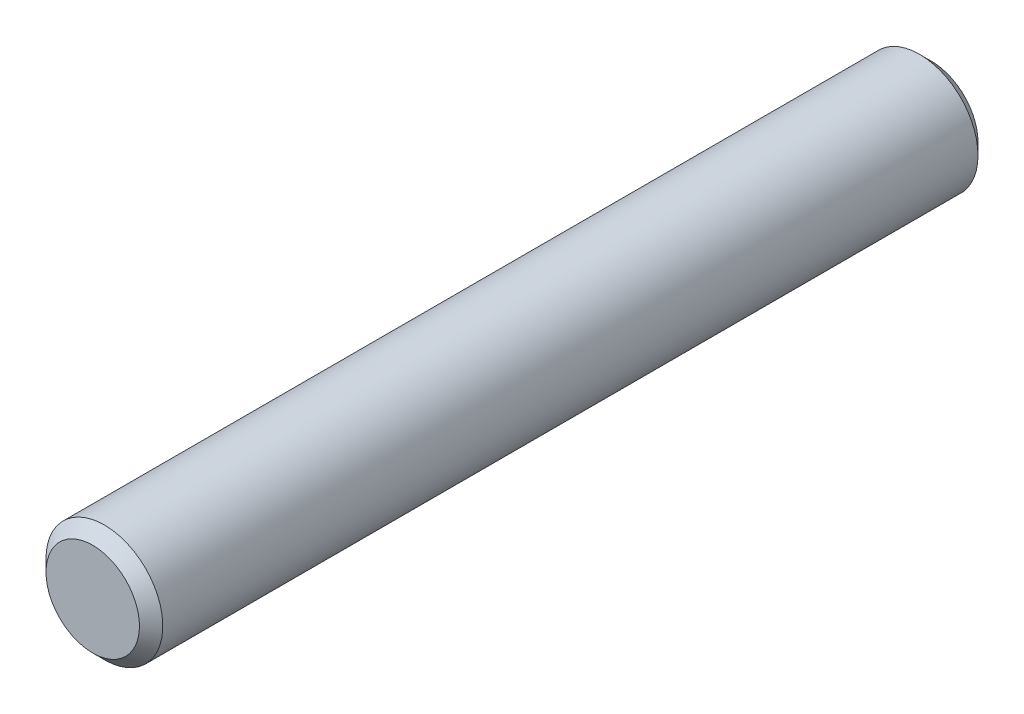
ISO-10303-21;
HEADER;
FILE_DESCRIPTION(('STEP AP214'),'2;1');
FILE_NAME('part.step','',(''),(''),'','','');
FILE_SCHEMA(('AUTOMOTIVE_DESIGN { 1 0 10303 214 1 1 1 1 }'));
ENDSEC;
DATA;
#1=APPLICATION_CONTEXT('core data for automotive mechanical design processes');
#2=APPLICATION_PROTOCOL_DEFINITION('international standard','automotive_design',2000,#1);
#3=PRODUCT_CONTEXT('',#1,'mechanical');
#4=PRODUCT('Part','Part','',(#3));
#5=PRODUCT_RELATED_PRODUCT_CATEGORY('part','',(#4));
#6=PRODUCT_DEFINITION_FORMATION('','',#4);
#7=PRODUCT_DEFINITION_CONTEXT('part definition',#1,'design');
#8=PRODUCT_DEFINITION('design','',#6,#7);
#9=PRODUCT_DEFINITION_SHAPE('','',#8);
#10=(LENGTH_UNIT() NAMED_UNIT(*) SI_UNIT(.MILLI.,.METRE.));
#11=(NAMED_UNIT(*) PLANE_ANGLE_UNIT() SI_UNIT($,.RADIAN.));
#12=(NAMED_UNIT(*) SI_UNIT($,.STERADIAN.) SOLID_ANGLE_UNIT());
#13=UNCERTAINTY_MEASURE_WITH_UNIT(LENGTH_MEASURE(1.E-05),#10,'distance_accuracy_value','');
#14=(GEOMETRIC_REPRESENTATION_CONTEXT(3) GLOBAL_UNCERTAINTY_ASSIGNED_CONTEXT((#13)) GLOBAL_UNIT_ASSIGNED_CONTEXT((#10,
#11,#12)) REPRESENTATION_CONTEXT('',''));
#15=CARTESIAN_POINT('',(0.,0.,0.));
#16=DIRECTION('',(0.,0.,1.));
#17=DIRECTION('',(1.,0.,0.));
#18=AXIS2_PLACEMENT_3D('',#15,#16,#17);
#19=CARTESIAN_POINT('',(0.278293131289104,3.89610398399644,0.));
#20=DIRECTION('',(0.,0.,-1.));
#21=DIRECTION('',(-1.,0.,0.));
#22=AXIS2_PLACEMENT_3D('',#19,#20,#21);
#23=PLANE('',#22);
#24=CARTESIAN_POINT('',(0.278293131289104,3.89610398399644,-2.27373675443232E-10));
#25=DIRECTION('',(0.,0.,1.));
#26=DIRECTION('',(1.,0.,0.));
#27=AXIS2_PLACEMENT_3D('',#24,#25,#26);
#28=CIRCLE('',#27,2.0000000002097);
#29=CARTESIAN_POINT('',(2.2782931314988,3.89610398399644,-2.27373675443232E-10));
#30=VERTEX_POINT('',#29);
#31=EDGE_CURVE('E19',#30,#30,#28,.T.);
#32=ORIENTED_EDGE('',*,*,#31,.F.);
#33=EDGE_LOOP('',(#32));
#34=FACE_BOUND('',#33,.T.);
#35=ADVANCED_FACE('F15',(#34),#23,.T.);
#36=CARTESIAN_POINT('',(0.278293131289104,3.89610398399644,35.9));
#37=DIRECTION('',(0.,0.,-1.));
#38=DIRECTION('',(-1.,0.,0.));
#39=AXIS2_PLACEMENT_3D('',#36,#37,#38);
#40=PLANE('',#39);
#41=CARTESIAN_POINT('',(0.278293131289104,3.89610398399644,35.9000000001402));
#42=DIRECTION('',(0.,0.,-1.));
#43=DIRECTION('',(-1.,0.,0.));
#44=AXIS2_PLACEMENT_3D('',#41,#42,#43);
#45=CIRCLE('',#44,2.00000000015285);
#46=CARTESIAN_POINT('',(-1.72170686886375,3.89610398399644,35.9000000001402));
#47=VERTEX_POINT('',#46);
#48=EDGE_CURVE('E28',#47,#47,#45,.T.);
#49=ORIENTED_EDGE('',*,*,#48,.F.);
#50=EDGE_LOOP('',(#49));
#51=FACE_BOUND('',#50,.T.);
#52=ADVANCED_FACE('F40',(#51),#40,.F.);
#53=CARTESIAN_POINT('',(0.278293131289104,3.89610398399644,0.50000000021555));
#54=DIRECTION('',(0.,0.,1.));
#55=DIRECTION('',(1.,0.,0.));
#56=AXIS2_PLACEMENT_3D('',#53,#54,#55);
#57=CONICAL_SURFACE('',#56,2.49999999974312,0.785398162487954);
#58=ORIENTED_EDGE('',*,*,#31,.T.);
#59=EDGE_LOOP('',(#58));
#60=FACE_BOUND('',#59,.T.);
#61=CARTESIAN_POINT('',(0.278293131289104,3.89610398399644,0.500000000000007));
#62=DIRECTION('',(0.,0.,1.));
#63=DIRECTION('',(-1.,0.,0.));
#64=AXIS2_PLACEMENT_3D('',#61,#62,#63);
#65=CIRCLE('',#64,2.50000000000001);
#66=CARTESIAN_POINT('',(-2.2217068687109,3.89610398399644,0.500000000000007));
#67=VERTEX_POINT('',#66);
#68=EDGE_CURVE('E23',#67,#67,#65,.T.);
#69=ORIENTED_EDGE('',*,*,#68,.F.);
#70=EDGE_LOOP('',(#69));
#71=FACE_BOUND('',#70,.T.);
#72=ADVANCED_FACE('F36',(#60,#71),#57,.T.);
#73=CARTESIAN_POINT('',(0.278293131289104,3.89610398399644,35.3999999996972));
#74=DIRECTION('',(0.,0.,-1.));
#75=DIRECTION('',(-1.,0.,0.));
#76=AXIS2_PLACEMENT_3D('',#73,#74,#75);
#77=CONICAL_SURFACE('',#76,2.49999999968628,0.785398162487954);
#78=ORIENTED_EDGE('',*,*,#48,.T.);
#79=EDGE_LOOP('',(#78));
#80=FACE_BOUND('',#79,.T.);
#81=CARTESIAN_POINT('',(0.278293131289104,3.89610398399644,35.4));
#82=DIRECTION('',(0.,0.,1.));
#83=DIRECTION('',(-1.,0.,0.));
#84=AXIS2_PLACEMENT_3D('',#81,#82,#83);
#85=CIRCLE('',#84,2.50000000000001);
#86=CARTESIAN_POINT('',(-2.2217068687109,3.89610398399644,35.4));
#87=VERTEX_POINT('',#86);
#88=EDGE_CURVE('E10',#87,#87,#85,.F.);
#89=ORIENTED_EDGE('',*,*,#88,.F.);
#90=EDGE_LOOP('',(#89));
#91=FACE_BOUND('',#90,.T.);
#92=ADVANCED_FACE('F49',(#80,#91),#77,.T.);
#93=CARTESIAN_POINT('',(0.278293131289104,3.89610398399644,0.500000000000007));
#94=DIRECTION('',(0.,0.,1.));
#95=DIRECTION('',(1.,0.,0.));
#96=AXIS2_PLACEMENT_3D('',#93,#94,#95);
#97=CYLINDRICAL_SURFACE('',#96,2.50000000000001);
#98=ORIENTED_EDGE('',*,*,#68,.T.);
#99=EDGE_LOOP('',(#98));
#100=FACE_BOUND('',#99,.T.);
#101=ORIENTED_EDGE('',*,*,#88,.T.);
#102=EDGE_LOOP('',(#101));
#103=FACE_BOUND('',#102,.T.);
#104=ADVANCED_FACE('F17',(#100,#103),#97,.T.);
#105=CLOSED_SHELL('',(#35,#52,#72,#92,#104));
#106=MANIFOLD_SOLID_BREP('B1',#105);
#107=ADVANCED_BREP_SHAPE_REPRESENTATION('',(#18,#106),#14);
#108=SHAPE_DEFINITION_REPRESENTATION(#9,#107);
ENDSEC;
END-ISO-10303-21;
